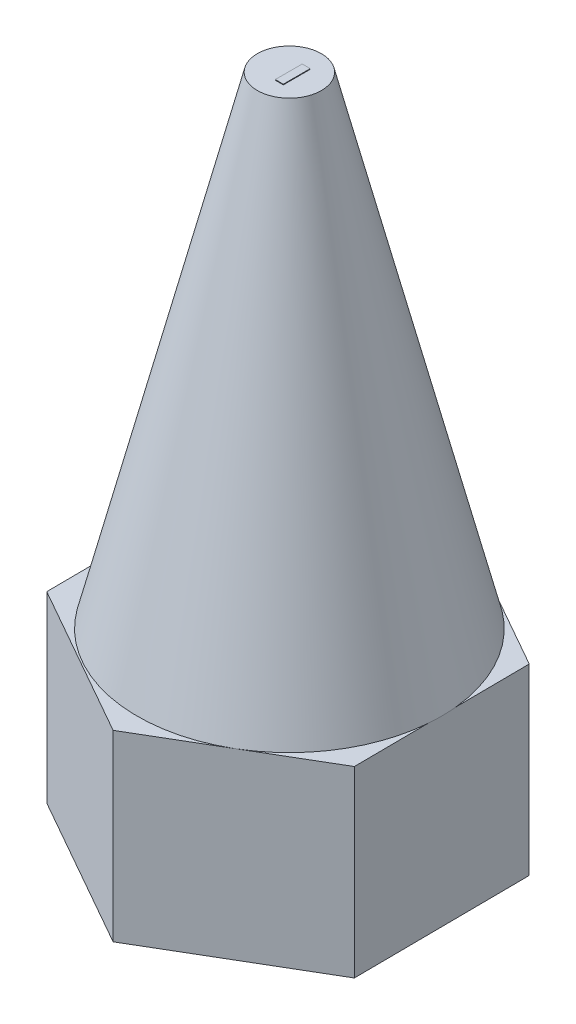
ISO-10303-21;
HEADER;
FILE_DESCRIPTION(('STEP AP214'),'2;1');
FILE_NAME('part.step','',(''),(''),'','','');
FILE_SCHEMA(('AUTOMOTIVE_DESIGN { 1 0 10303 214 1 1 1 1 }'));
ENDSEC;
DATA;
#1=APPLICATION_CONTEXT('core data for automotive mechanical design processes');
#2=APPLICATION_PROTOCOL_DEFINITION('international standard','automotive_design',2000,#1);
#3=PRODUCT_CONTEXT('',#1,'mechanical');
#4=PRODUCT('Part','Part','',(#3));
#5=PRODUCT_RELATED_PRODUCT_CATEGORY('part','',(#4));
#6=PRODUCT_DEFINITION_FORMATION('','',#4);
#7=PRODUCT_DEFINITION_CONTEXT('part definition',#1,'design');
#8=PRODUCT_DEFINITION('design','',#6,#7);
#9=PRODUCT_DEFINITION_SHAPE('','',#8);
#10=(LENGTH_UNIT() NAMED_UNIT(*) SI_UNIT(.MILLI.,.METRE.));
#11=(NAMED_UNIT(*) PLANE_ANGLE_UNIT() SI_UNIT($,.RADIAN.));
#12=(NAMED_UNIT(*) SI_UNIT($,.STERADIAN.) SOLID_ANGLE_UNIT());
#13=UNCERTAINTY_MEASURE_WITH_UNIT(LENGTH_MEASURE(1.E-05),#10,'distance_accuracy_value','');
#14=(GEOMETRIC_REPRESENTATION_CONTEXT(3) GLOBAL_UNCERTAINTY_ASSIGNED_CONTEXT((#13)) GLOBAL_UNIT_ASSIGNED_CONTEXT((#10,
#11,#12)) REPRESENTATION_CONTEXT('',''));
#15=CARTESIAN_POINT('',(0.,0.,0.));
#16=DIRECTION('',(0.,0.,1.));
#17=DIRECTION('',(1.,0.,0.));
#18=AXIS2_PLACEMENT_3D('',#15,#16,#17);
#19=CARTESIAN_POINT('',(9.52838152991119,54.4716616149149,16.2124601536663));
#20=DIRECTION('',(0.,-1.,0.));
#21=DIRECTION('',(0.,0.,-1.));
#22=AXIS2_PLACEMENT_3D('',#19,#20,#21);
#23=PLANE('',#22);
#24=CARTESIAN_POINT('',(0.111746806059591,54.4716616149149,0.));
#25=DIRECTION('',(0.,-1.,0.));
#26=DIRECTION('',(0.,0.,-1.));
#27=AXIS2_PLACEMENT_3D('',#24,#25,#26);
#28=CIRCLE('',#27,2.62024063059336);
#29=CARTESIAN_POINT('',(0.111746806059591,54.4716616149149,-2.62024063059336));
#30=VERTEX_POINT('',#29);
#31=EDGE_CURVE('E50',#30,#30,#28,.F.);
#32=ORIENTED_EDGE('',*,*,#31,.T.);
#33=EDGE_LOOP('',(#32));
#34=FACE_BOUND('',#33,.T.);
#35=DIRECTION('',(0.,0.,1.));
#36=VECTOR('',#35,1.);
#37=CARTESIAN_POINT('',(0.111746806059591,54.4716616149149,1.15442501951279));
#38=LINE('',#37,#36);
#39=CARTESIAN_POINT('',(0.111746806059591,54.4716616149149,-1.0510821528892));
#40=VERTEX_POINT('',#39);
#41=CARTESIAN_POINT('',(0.111746806059591,54.4716616149149,1.15442501951279));
#42=VERTEX_POINT('',#41);
#43=EDGE_CURVE('E64',#40,#42,#38,.T.);
#44=ORIENTED_EDGE('',*,*,#43,.F.);
#45=DIRECTION('',(-1.,0.,0.));
#46=VECTOR('',#45,1.);
#47=CARTESIAN_POINT('',(0.111746806059591,54.4716616149149,-1.0510821528892));
#48=LINE('',#47,#46);
#49=CARTESIAN_POINT('',(0.770418133316449,54.4716616149149,-1.0510821528892));
#50=VERTEX_POINT('',#49);
#51=EDGE_CURVE('E68',#50,#40,#48,.T.);
#52=ORIENTED_EDGE('',*,*,#51,.F.);
#53=DIRECTION('',(0.,0.,-1.));
#54=VECTOR('',#53,1.);
#55=CARTESIAN_POINT('',(0.770418133316449,54.4716616149149,1.15442501951279));
#56=LINE('',#55,#54);
#57=CARTESIAN_POINT('',(0.770418133316449,54.4716616149149,1.15442501951279));
#58=VERTEX_POINT('',#57);
#59=EDGE_CURVE('E486',#58,#50,#56,.T.);
#60=ORIENTED_EDGE('',*,*,#59,.F.);
#61=DIRECTION('',(1.,0.,0.));
#62=VECTOR('',#61,1.);
#63=CARTESIAN_POINT('',(0.111746806059591,54.4716616149149,1.15442501951279));
#64=LINE('',#63,#62);
#65=EDGE_CURVE('E496',#42,#58,#64,.T.);
#66=ORIENTED_EDGE('',*,*,#65,.F.);
#67=EDGE_LOOP('',(#44,#52,#60,#66));
#68=FACE_BOUND('',#67,.T.);
#69=ADVANCED_FACE('F45',(#34,#68),#23,.F.);
#70=CARTESIAN_POINT('',(0.,15.,0.));
#71=DIRECTION('',(0.,1.,0.));
#72=DIRECTION('',(0.,0.,1.));
#73=AXIS2_PLACEMENT_3D('',#70,#71,#72);
#74=PLANE('',#73);
#75=CARTESIAN_POINT('',(0.111746806059591,15.,0.));
#76=DIRECTION('',(0.,1.,0.));
#77=DIRECTION('',(0.,0.,1.));
#78=AXIS2_PLACEMENT_3D('',#75,#76,#77);
#79=CIRCLE('',#78,12.4437519708965);
#80=CARTESIAN_POINT('',(6.49973786564512,15.,10.6789762306995));
#81=VERTEX_POINT('',#80);
#82=CARTESIAN_POINT('',(12.5087205311944,15.,1.07796362253372));
#83=VERTEX_POINT('',#82);
#84=EDGE_CURVE('E11',#81,#83,#79,.T.);
#85=ORIENTED_EDGE('',*,*,#84,.F.);
#86=DIRECTION('',(0.862128426015122,0.,-0.506689823320627));
#87=VECTOR('',#86,1.);
#88=CARTESIAN_POINT('',(0.111746806059591,15.,14.4333241488116));
#89=LINE('',#88,#87);
#90=CARTESIAN_POINT('',(12.5554987769561,15.,7.11988650156643));
#91=VERTEX_POINT('',#90);
#92=EDGE_CURVE('E269',#81,#91,#89,.T.);
#93=ORIENTED_EDGE('',*,*,#92,.T.);
#94=DIRECTION('',(-0.00774204582715023,0.,-0.999970029914102));
#95=VECTOR('',#94,1.);
#96=CARTESIAN_POINT('',(12.5554987769561,15.,7.11988650156643));
#97=LINE('',#96,#95);
#98=EDGE_CURVE('E279',#91,#83,#97,.T.);
#99=ORIENTED_EDGE('',*,*,#98,.T.);
#100=EDGE_LOOP('',(#85,#93,#99));
#101=FACE_BOUND('',#100,.T.);
#102=ADVANCED_FACE('F215',(#101),#74,.T.);
#103=CARTESIAN_POINT('',(0.111746806059591,15.,14.4333241488116));
#104=DIRECTION('',(-0.506689823320627,0.,-0.862128426015122));
#105=DIRECTION('',(-0.862128426015122,0.,0.506689823320627));
#106=AXIS2_PLACEMENT_3D('',#103,#104,#105);
#107=PLANE('',#106);
#108=DIRECTION('',(0.862128426015122,0.,-0.506689823320627));
#109=VECTOR('',#108,1.);
#110=CARTESIAN_POINT('',(0.111746806059591,0.,14.4333241488116));
#111=LINE('',#110,#109);
#112=CARTESIAN_POINT('',(0.111746806059591,0.,14.4333241488116));
#113=VERTEX_POINT('',#112);
#114=CARTESIAN_POINT('',(12.5554987769561,0.,7.11988650156643));
#115=VERTEX_POINT('',#114);
#116=EDGE_CURVE('E179',#113,#115,#111,.T.);
#117=ORIENTED_EDGE('',*,*,#116,.T.);
#118=DIRECTION('',(0.,-1.,0.));
#119=VECTOR('',#118,1.);
#120=CARTESIAN_POINT('',(12.5554987769561,15.,7.11988650156643));
#121=LINE('',#120,#119);
#122=EDGE_CURVE('E315',#91,#115,#121,.T.);
#123=ORIENTED_EDGE('',*,*,#122,.F.);
#124=ORIENTED_EDGE('',*,*,#92,.F.);
#125=CARTESIAN_POINT('',(0.111746806059591,15.,0.));
#126=DIRECTION('',(0.,1.,0.));
#127=DIRECTION('',(0.499999999999968,0.,0.866025403784457));
#128=AXIS2_PLACEMENT_3D('',#125,#126,#127);
#129=CIRCLE('',#128,12.4437519708965);
#130=CARTESIAN_POINT('',(6.33362279150744,15.,10.7766053251893));
#131=VERTEX_POINT('',#130);
#132=EDGE_CURVE('E185',#131,#81,#129,.T.);
#133=ORIENTED_EDGE('',*,*,#132,.F.);
#134=CARTESIAN_POINT('',(0.111746806059591,15.,14.4333241488116));
#135=VERTEX_POINT('',#134);
#136=EDGE_CURVE('E273',#135,#131,#89,.T.);
#137=ORIENTED_EDGE('',*,*,#136,.F.);
#138=DIRECTION('',(0.,-1.,0.));
#139=VECTOR('',#138,1.);
#140=CARTESIAN_POINT('',(0.111746806059591,15.,14.4333241488116));
#141=LINE('',#140,#139);
#142=EDGE_CURVE('E295',#135,#113,#141,.T.);
#143=ORIENTED_EDGE('',*,*,#142,.T.);
#144=EDGE_LOOP('',(#117,#123,#124,#133,#137,#143));
#145=FACE_BOUND('',#144,.T.);
#146=ADVANCED_FACE('F47',(#145),#107,.F.);
#147=CARTESIAN_POINT('',(12.5554987769561,15.,7.11988650156643));
#148=DIRECTION('',(-0.999970029914102,0.,0.00774204582715023));
#149=DIRECTION('',(0.00774204582715023,0.,0.999970029914102));
#150=AXIS2_PLACEMENT_3D('',#147,#148,#149);
#151=PLANE('',#150);
#152=DIRECTION('',(-0.00774204582715023,0.,-0.999970029914102));
#153=VECTOR('',#152,1.);
#154=CARTESIAN_POINT('',(12.5554987769561,0.,7.11988650156643));
#155=LINE('',#154,#153);
#156=CARTESIAN_POINT('',(12.4437519708965,0.,-7.31343764724518));
#157=VERTEX_POINT('',#156);
#158=EDGE_CURVE('E254',#115,#157,#155,.T.);
#159=ORIENTED_EDGE('',*,*,#158,.T.);
#160=DIRECTION('',(0.,-1.,0.));
#161=VECTOR('',#160,1.);
#162=CARTESIAN_POINT('',(12.4437519708965,15.,-7.31343764724518));
#163=LINE('',#162,#161);
#164=CARTESIAN_POINT('',(12.4437519708965,15.,-7.31343764724518));
#165=VERTEX_POINT('',#164);
#166=EDGE_CURVE('E311',#165,#157,#163,.T.);
#167=ORIENTED_EDGE('',*,*,#166,.F.);
#168=CARTESIAN_POINT('',(12.4905436127029,15.,-1.26978452228255));
#169=VERTEX_POINT('',#168);
#170=EDGE_CURVE('E275',#169,#165,#97,.T.);
#171=ORIENTED_EDGE('',*,*,#170,.F.);
#172=EDGE_CURVE('E278',#83,#169,#97,.T.);
#173=ORIENTED_EDGE('',*,*,#172,.F.);
#174=ORIENTED_EDGE('',*,*,#98,.F.);
#175=ORIENTED_EDGE('',*,*,#122,.T.);
#176=EDGE_LOOP('',(#159,#167,#171,#173,#174,#175));
#177=FACE_BOUND('',#176,.T.);
#178=ADVANCED_FACE('F232',(#177),#151,.F.);
#179=CARTESIAN_POINT('',(12.4437519708965,15.,-7.31343764724518));
#180=DIRECTION('',(-0.493280206593476,0.,0.869870471842273));
#181=DIRECTION('',(0.869870471842273,0.,0.493280206593476));
#182=AXIS2_PLACEMENT_3D('',#179,#180,#181);
#183=PLANE('',#182);
#184=DIRECTION('',(-0.869870471842273,0.,-0.493280206593476));
#185=VECTOR('',#184,1.);
#186=CARTESIAN_POINT('',(12.4437519708965,0.,-7.31343764724518));
#187=LINE('',#186,#185);
#188=CARTESIAN_POINT('',(-0.111746806059592,0.,-14.4333241488116));
#189=VERTEX_POINT('',#188);
#190=EDGE_CURVE('E257',#157,#189,#187,.T.);
#191=ORIENTED_EDGE('',*,*,#190,.T.);
#192=DIRECTION('',(0.,-1.,0.));
#193=VECTOR('',#192,1.);
#194=CARTESIAN_POINT('',(-0.111746806059592,15.,-14.4333241488116));
#195=LINE('',#194,#193);
#196=CARTESIAN_POINT('',(-0.111746806059592,15.,-14.4333241488116));
#197=VERTEX_POINT('',#196);
#198=EDGE_CURVE('E307',#197,#189,#195,.T.);
#199=ORIENTED_EDGE('',*,*,#198,.F.);
#200=DIRECTION('',(-0.869870471842273,0.,-0.493280206593476));
#201=VECTOR('',#200,1.);
#202=CARTESIAN_POINT('',(12.4437519708965,15.,-7.31343764724518));
#203=LINE('',#202,#201);
#204=EDGE_CURVE('E284',#165,#197,#203,.T.);
#205=ORIENTED_EDGE('',*,*,#204,.F.);
#206=ORIENTED_EDGE('',*,*,#166,.T.);
#207=EDGE_LOOP('',(#191,#199,#205,#206));
#208=FACE_BOUND('',#207,.T.);
#209=ADVANCED_FACE('F229',(#208),#183,.F.);
#210=CARTESIAN_POINT('',(-0.111746806059592,15.,-14.4333241488116));
#211=DIRECTION('',(0.506689823320627,0.,0.862128426015122));
#212=DIRECTION('',(0.862128426015122,0.,-0.506689823320627));
#213=AXIS2_PLACEMENT_3D('',#210,#211,#212);
#214=PLANE('',#213);
#215=DIRECTION('',(-0.862128426015122,0.,0.506689823320627));
#216=VECTOR('',#215,1.);
#217=CARTESIAN_POINT('',(-0.111746806059592,0.,-14.4333241488116));
#218=LINE('',#217,#216);
#219=CARTESIAN_POINT('',(-12.5554987769561,0.,-7.11988650156643));
#220=VERTEX_POINT('',#219);
#221=EDGE_CURVE('E260',#189,#220,#218,.T.);
#222=ORIENTED_EDGE('',*,*,#221,.T.);
#223=DIRECTION('',(0.,-1.,0.));
#224=VECTOR('',#223,1.);
#225=CARTESIAN_POINT('',(-12.5554987769561,15.,-7.11988650156643));
#226=LINE('',#225,#224);
#227=CARTESIAN_POINT('',(-12.5554987769561,15.,-7.11988650156643));
#228=VERTEX_POINT('',#227);
#229=EDGE_CURVE('E303',#228,#220,#226,.T.);
#230=ORIENTED_EDGE('',*,*,#229,.F.);
#231=DIRECTION('',(-0.862128426015122,0.,0.506689823320627));
#232=VECTOR('',#231,1.);
#233=CARTESIAN_POINT('',(-0.111746806059592,15.,-14.4333241488116));
#234=LINE('',#233,#232);
#235=EDGE_CURVE('E286',#197,#228,#234,.T.);
#236=ORIENTED_EDGE('',*,*,#235,.F.);
#237=ORIENTED_EDGE('',*,*,#198,.T.);
#238=EDGE_LOOP('',(#222,#230,#236,#237));
#239=FACE_BOUND('',#238,.T.);
#240=ADVANCED_FACE('F225',(#239),#214,.F.);
#241=CARTESIAN_POINT('',(-12.5554987769561,15.,-7.11988650156643));
#242=DIRECTION('',(0.999970029914102,0.,-0.00774204582715034));
#243=DIRECTION('',(-0.00774204582715034,0.,-0.999970029914102));
#244=AXIS2_PLACEMENT_3D('',#241,#242,#243);
#245=PLANE('',#244);
#246=DIRECTION('',(0.00774204582715034,0.,0.999970029914102));
#247=VECTOR('',#246,1.);
#248=CARTESIAN_POINT('',(-12.5554987769561,0.,-7.11988650156643));
#249=LINE('',#248,#247);
#250=CARTESIAN_POINT('',(-12.4437519708965,0.,7.31343764724519));
#251=VERTEX_POINT('',#250);
#252=EDGE_CURVE('E263',#220,#251,#249,.T.);
#253=ORIENTED_EDGE('',*,*,#252,.T.);
#254=DIRECTION('',(0.,-1.,0.));
#255=VECTOR('',#254,1.);
#256=CARTESIAN_POINT('',(-12.4437519708965,15.,7.31343764724519));
#257=LINE('',#256,#255);
#258=CARTESIAN_POINT('',(-12.4437519708965,15.,7.31343764724519));
#259=VERTEX_POINT('',#258);
#260=EDGE_CURVE('E299',#259,#251,#257,.T.);
#261=ORIENTED_EDGE('',*,*,#260,.F.);
#262=DIRECTION('',(0.00774204582715034,0.,0.999970029914102));
#263=VECTOR('',#262,1.);
#264=CARTESIAN_POINT('',(-12.5554987769561,15.,-7.11988650156643));
#265=LINE('',#264,#263);
#266=EDGE_CURVE('E289',#228,#259,#265,.T.);
#267=ORIENTED_EDGE('',*,*,#266,.F.);
#268=ORIENTED_EDGE('',*,*,#229,.T.);
#269=EDGE_LOOP('',(#253,#261,#267,#268));
#270=FACE_BOUND('',#269,.T.);
#271=ADVANCED_FACE('F221',(#270),#245,.F.);
#272=CARTESIAN_POINT('',(-12.4437519708965,15.,7.31343764724519));
#273=DIRECTION('',(0.493280206593476,0.,-0.869870471842272));
#274=DIRECTION('',(-0.869870471842273,0.,-0.493280206593476));
#275=AXIS2_PLACEMENT_3D('',#272,#273,#274);
#276=PLANE('',#275);
#277=DIRECTION('',(0.869870471842273,0.,0.493280206593476));
#278=VECTOR('',#277,1.);
#279=CARTESIAN_POINT('',(-12.4437519708965,0.,7.31343764724519));
#280=LINE('',#279,#278);
#281=EDGE_CURVE('E266',#251,#113,#280,.T.);
#282=ORIENTED_EDGE('',*,*,#281,.T.);
#283=ORIENTED_EDGE('',*,*,#142,.F.);
#284=DIRECTION('',(0.869870471842273,0.,0.493280206593476));
#285=VECTOR('',#284,1.);
#286=CARTESIAN_POINT('',(-12.4437519708965,15.,7.31343764724519));
#287=LINE('',#286,#285);
#288=EDGE_CURVE('E292',#259,#135,#287,.T.);
#289=ORIENTED_EDGE('',*,*,#288,.F.);
#290=ORIENTED_EDGE('',*,*,#260,.T.);
#291=EDGE_LOOP('',(#282,#283,#289,#290));
#292=FACE_BOUND('',#291,.T.);
#293=ADVANCED_FACE('F213',(#292),#276,.F.);
#294=EDGE_CURVE('E56',#169,#131,#79,.T.);
#295=ORIENTED_EDGE('',*,*,#294,.F.);
#296=ORIENTED_EDGE('',*,*,#170,.T.);
#297=ORIENTED_EDGE('',*,*,#204,.T.);
#298=ORIENTED_EDGE('',*,*,#235,.T.);
#299=ORIENTED_EDGE('',*,*,#266,.T.);
#300=ORIENTED_EDGE('',*,*,#288,.T.);
#301=ORIENTED_EDGE('',*,*,#136,.T.);
#302=EDGE_LOOP('',(#295,#296,#297,#298,#299,#300,#301));
#303=FACE_BOUND('',#302,.T.);
#304=ADVANCED_FACE('F210',(#303),#74,.T.);
#305=CARTESIAN_POINT('',(0.,0.,0.));
#306=DIRECTION('',(0.,1.,0.));
#307=DIRECTION('',(0.,0.,1.));
#308=AXIS2_PLACEMENT_3D('',#305,#306,#307);
#309=PLANE('',#308);
#310=CARTESIAN_POINT('',(0.,0.,0.));
#311=DIRECTION('',(0.,-1.,0.));
#312=DIRECTION('',(0.,0.,-1.));
#313=AXIS2_PLACEMENT_3D('',#310,#311,#312);
#314=CIRCLE('',#313,1.5);
#315=CARTESIAN_POINT('',(0.,0.,-1.5));
#316=VERTEX_POINT('',#315);
#317=EDGE_CURVE('E161',#316,#316,#314,.T.);
#318=ORIENTED_EDGE('',*,*,#317,.F.);
#319=EDGE_LOOP('',(#318));
#320=FACE_BOUND('',#319,.T.);
#321=ORIENTED_EDGE('',*,*,#116,.F.);
#322=ORIENTED_EDGE('',*,*,#281,.F.);
#323=ORIENTED_EDGE('',*,*,#252,.F.);
#324=ORIENTED_EDGE('',*,*,#221,.F.);
#325=ORIENTED_EDGE('',*,*,#190,.F.);
#326=ORIENTED_EDGE('',*,*,#158,.F.);
#327=EDGE_LOOP('',(#321,#322,#323,#324,#325,#326));
#328=FACE_BOUND('',#327,.T.);
#329=ADVANCED_FACE('F208',(#320,#328),#309,.F.);
#330=CARTESIAN_POINT('',(12.5554987769561,15.,0.));
#331=DIRECTION('',(0.,-1.,0.));
#332=DIRECTION('',(0.,0.,-1.));
#333=AXIS2_PLACEMENT_3D('',#330,#331,#332);
#334=PLANE('',#333);
#335=ORIENTED_EDGE('',*,*,#172,.T.);
#336=CARTESIAN_POINT('',(0.111746806059591,15.,0.));
#337=DIRECTION('',(0.,-1.,0.));
#338=DIRECTION('',(0.,0.,-1.));
#339=AXIS2_PLACEMENT_3D('',#336,#337,#338);
#340=CIRCLE('',#339,12.4437519708965);
#341=EDGE_CURVE('E175',#169,#83,#340,.T.);
#342=ORIENTED_EDGE('',*,*,#341,.T.);
#343=EDGE_LOOP('',(#335,#342));
#344=FACE_BOUND('',#343,.T.);
#345=ADVANCED_FACE('F203',(#344),#334,.T.);
#346=CARTESIAN_POINT('',(0.111746806059591,15.,0.));
#347=DIRECTION('',(0.,-1.,0.));
#348=DIRECTION('',(0.,0.,-1.));
#349=AXIS2_PLACEMENT_3D('',#346,#347,#348);
#350=CONICAL_SURFACE('',#349,12.4437519708965,0.243919596761259);
#351=ORIENTED_EDGE('',*,*,#31,.F.);
#352=EDGE_LOOP('',(#351));
#353=FACE_BOUND('',#352,.T.);
#354=ORIENTED_EDGE('',*,*,#341,.F.);
#355=ORIENTED_EDGE('',*,*,#294,.T.);
#356=ORIENTED_EDGE('',*,*,#132,.T.);
#357=ORIENTED_EDGE('',*,*,#84,.T.);
#358=EDGE_LOOP('',(#354,#355,#356,#357));
#359=FACE_BOUND('',#358,.T.);
#360=ADVANCED_FACE('F192',(#353,#359),#350,.T.);
#361=CARTESIAN_POINT('',(0.,1.,0.));
#362=DIRECTION('',(0.,-1.,0.));
#363=DIRECTION('',(0.,0.,-1.));
#364=AXIS2_PLACEMENT_3D('',#361,#362,#363);
#365=CYLINDRICAL_SURFACE('',#364,1.5);
#366=CARTESIAN_POINT('',(0.,1.,0.));
#367=DIRECTION('',(0.,-1.,0.));
#368=DIRECTION('',(0.,0.,-1.));
#369=AXIS2_PLACEMENT_3D('',#366,#367,#368);
#370=CIRCLE('',#369,1.5);
#371=CARTESIAN_POINT('',(0.,1.,-1.5));
#372=VERTEX_POINT('',#371);
#373=EDGE_CURVE('E166',#372,#372,#370,.T.);
#374=ORIENTED_EDGE('',*,*,#373,.F.);
#375=EDGE_LOOP('',(#374));
#376=FACE_BOUND('',#375,.T.);
#377=ORIENTED_EDGE('',*,*,#317,.T.);
#378=EDGE_LOOP('',(#377));
#379=FACE_BOUND('',#378,.T.);
#380=ADVANCED_FACE('F202',(#376,#379),#365,.F.);
#381=CARTESIAN_POINT('',(0.,1.,0.));
#382=DIRECTION('',(0.,-1.,0.));
#383=DIRECTION('',(0.,0.,-1.));
#384=AXIS2_PLACEMENT_3D('',#381,#382,#383);
#385=PLANE('',#384);
#386=ORIENTED_EDGE('',*,*,#373,.T.);
#387=EDGE_LOOP('',(#386));
#388=FACE_BOUND('',#387,.T.);
#389=ADVANCED_FACE('F424',(#388),#385,.T.);
#390=CARTESIAN_POINT('',(0.111746806059591,54.5216616149149,1.15442501951279));
#391=DIRECTION('',(1.,0.,0.));
#392=DIRECTION('',(0.,0.,-1.));
#393=AXIS2_PLACEMENT_3D('',#390,#391,#392);
#394=PLANE('',#393);
#395=ORIENTED_EDGE('',*,*,#43,.T.);
#396=DIRECTION('',(0.,-1.,0.));
#397=VECTOR('',#396,1.);
#398=CARTESIAN_POINT('',(0.111746806059591,54.5216616149149,1.15442501951279));
#399=LINE('',#398,#397);
#400=CARTESIAN_POINT('',(0.111746806059591,54.5216616149149,1.15442501951279));
#401=VERTEX_POINT('',#400);
#402=EDGE_CURVE('E141',#401,#42,#399,.T.);
#403=ORIENTED_EDGE('',*,*,#402,.F.);
#404=DIRECTION('',(0.,0.,1.));
#405=VECTOR('',#404,1.);
#406=CARTESIAN_POINT('',(0.111746806059591,54.5216616149149,1.15442501951279));
#407=LINE('',#406,#405);
#408=CARTESIAN_POINT('',(0.111746806059591,54.5216616149149,-1.0510821528892));
#409=VERTEX_POINT('',#408);
#410=EDGE_CURVE('E148',#409,#401,#407,.T.);
#411=ORIENTED_EDGE('',*,*,#410,.F.);
#412=DIRECTION('',(0.,-1.,0.));
#413=VECTOR('',#412,1.);
#414=CARTESIAN_POINT('',(0.111746806059591,54.5216616149149,-1.0510821528892));
#415=LINE('',#414,#413);
#416=EDGE_CURVE('E483',#409,#40,#415,.T.);
#417=ORIENTED_EDGE('',*,*,#416,.T.);
#418=EDGE_LOOP('',(#395,#403,#411,#417));
#419=FACE_BOUND('',#418,.T.);
#420=ADVANCED_FACE('F159',(#419),#394,.F.);
#421=CARTESIAN_POINT('',(0.111746806059591,54.5216616149149,1.15442501951279));
#422=DIRECTION('',(0.,0.,-1.));
#423=DIRECTION('',(-1.,0.,0.));
#424=AXIS2_PLACEMENT_3D('',#421,#422,#423);
#425=PLANE('',#424);
#426=ORIENTED_EDGE('',*,*,#65,.T.);
#427=DIRECTION('',(0.,-1.,0.));
#428=VECTOR('',#427,1.);
#429=CARTESIAN_POINT('',(0.770418133316449,54.5216616149149,1.15442501951279));
#430=LINE('',#429,#428);
#431=CARTESIAN_POINT('',(0.770418133316449,54.5216616149149,1.15442501951279));
#432=VERTEX_POINT('',#431);
#433=EDGE_CURVE('E143',#432,#58,#430,.T.);
#434=ORIENTED_EDGE('',*,*,#433,.F.);
#435=DIRECTION('',(1.,0.,0.));
#436=VECTOR('',#435,1.);
#437=CARTESIAN_POINT('',(0.111746806059591,54.5216616149149,1.15442501951279));
#438=LINE('',#437,#436);
#439=EDGE_CURVE('E136',#401,#432,#438,.T.);
#440=ORIENTED_EDGE('',*,*,#439,.F.);
#441=ORIENTED_EDGE('',*,*,#402,.T.);
#442=EDGE_LOOP('',(#426,#434,#440,#441));
#443=FACE_BOUND('',#442,.T.);
#444=ADVANCED_FACE('F139',(#443),#425,.F.);
#445=CARTESIAN_POINT('',(0.770418133316449,54.5216616149149,1.15442501951279));
#446=DIRECTION('',(-1.,0.,0.));
#447=DIRECTION('',(0.,0.,1.));
#448=AXIS2_PLACEMENT_3D('',#445,#446,#447);
#449=PLANE('',#448);
#450=ORIENTED_EDGE('',*,*,#59,.T.);
#451=DIRECTION('',(0.,-1.,0.));
#452=VECTOR('',#451,1.);
#453=CARTESIAN_POINT('',(0.770418133316449,54.5216616149149,-1.0510821528892));
#454=LINE('',#453,#452);
#455=CARTESIAN_POINT('',(0.770418133316449,54.5216616149149,-1.0510821528892));
#456=VERTEX_POINT('',#455);
#457=EDGE_CURVE('E168',#456,#50,#454,.T.);
#458=ORIENTED_EDGE('',*,*,#457,.F.);
#459=DIRECTION('',(0.,0.,-1.));
#460=VECTOR('',#459,1.);
#461=CARTESIAN_POINT('',(0.770418133316449,54.5216616149149,1.15442501951279));
#462=LINE('',#461,#460);
#463=EDGE_CURVE('E147',#432,#456,#462,.T.);
#464=ORIENTED_EDGE('',*,*,#463,.F.);
#465=ORIENTED_EDGE('',*,*,#433,.T.);
#466=EDGE_LOOP('',(#450,#458,#464,#465));
#467=FACE_BOUND('',#466,.T.);
#468=ADVANCED_FACE('F452',(#467),#449,.F.);
#469=CARTESIAN_POINT('',(0.111746806059591,54.5216616149149,-1.0510821528892));
#470=DIRECTION('',(0.,0.,1.));
#471=DIRECTION('',(1.,0.,0.));
#472=AXIS2_PLACEMENT_3D('',#469,#470,#471);
#473=PLANE('',#472);
#474=ORIENTED_EDGE('',*,*,#51,.T.);
#475=ORIENTED_EDGE('',*,*,#416,.F.);
#476=DIRECTION('',(-1.,0.,0.));
#477=VECTOR('',#476,1.);
#478=CARTESIAN_POINT('',(0.111746806059591,54.5216616149149,-1.0510821528892));
#479=LINE('',#478,#477);
#480=EDGE_CURVE('E153',#456,#409,#479,.T.);
#481=ORIENTED_EDGE('',*,*,#480,.F.);
#482=ORIENTED_EDGE('',*,*,#457,.T.);
#483=EDGE_LOOP('',(#474,#475,#481,#482));
#484=FACE_BOUND('',#483,.T.);
#485=ADVANCED_FACE('F461',(#484),#473,.F.);
#486=CARTESIAN_POINT('',(0.,54.5216616149149,0.));
#487=DIRECTION('',(0.,-1.,0.));
#488=DIRECTION('',(0.,0.,-1.));
#489=AXIS2_PLACEMENT_3D('',#486,#487,#488);
#490=PLANE('',#489);
#491=ORIENTED_EDGE('',*,*,#410,.T.);
#492=ORIENTED_EDGE('',*,*,#439,.T.);
#493=ORIENTED_EDGE('',*,*,#463,.T.);
#494=ORIENTED_EDGE('',*,*,#480,.T.);
#495=EDGE_LOOP('',(#491,#492,#493,#494));
#496=FACE_BOUND('',#495,.T.);
#497=ADVANCED_FACE('F151',(#496),#490,.F.);
#498=CLOSED_SHELL('',(#69,#102,#146,#178,#209,#240,#271,#293,#304,#329,#345,#360,#380,#389,#420,
#444,#468,#485,#497));
#499=MANIFOLD_SOLID_BREP('B2',#498);
#500=ADVANCED_BREP_SHAPE_REPRESENTATION('',(#18,#499),#14);
#501=SHAPE_DEFINITION_REPRESENTATION(#9,#500);
ENDSEC;
END-ISO-10303-21;
